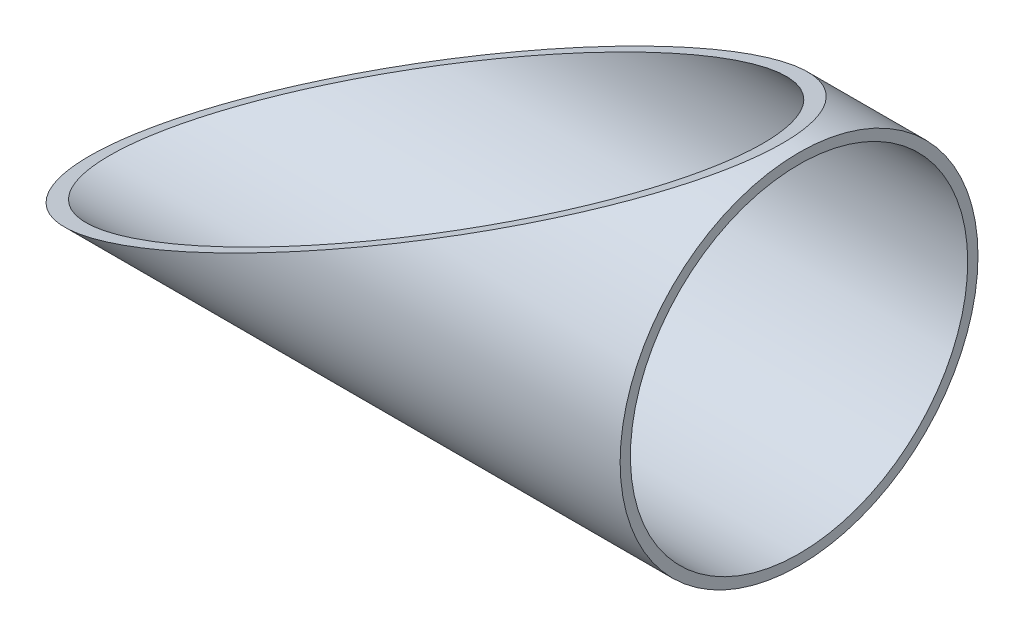
ISO-10303-21;
HEADER;
FILE_DESCRIPTION(('STEP AP214'),'2;1');
FILE_NAME('part.step','',(''),(''),'','','');
FILE_SCHEMA(('AUTOMOTIVE_DESIGN { 1 0 10303 214 1 1 1 1 }'));
ENDSEC;
DATA;
#1=APPLICATION_CONTEXT('core data for automotive mechanical design processes');
#2=APPLICATION_PROTOCOL_DEFINITION('international standard','automotive_design',2000,#1);
#3=PRODUCT_CONTEXT('',#1,'mechanical');
#4=PRODUCT('Part','Part','',(#3));
#5=PRODUCT_RELATED_PRODUCT_CATEGORY('part','',(#4));
#6=PRODUCT_DEFINITION_FORMATION('','',#4);
#7=PRODUCT_DEFINITION_CONTEXT('part definition',#1,'design');
#8=PRODUCT_DEFINITION('design','',#6,#7);
#9=PRODUCT_DEFINITION_SHAPE('','',#8);
#10=(LENGTH_UNIT() NAMED_UNIT(*) SI_UNIT(.MILLI.,.METRE.));
#11=(NAMED_UNIT(*) PLANE_ANGLE_UNIT() SI_UNIT($,.RADIAN.));
#12=(NAMED_UNIT(*) SI_UNIT($,.STERADIAN.) SOLID_ANGLE_UNIT());
#13=UNCERTAINTY_MEASURE_WITH_UNIT(LENGTH_MEASURE(1.E-05),#10,'distance_accuracy_value','');
#14=(GEOMETRIC_REPRESENTATION_CONTEXT(3) GLOBAL_UNCERTAINTY_ASSIGNED_CONTEXT((#13)) GLOBAL_UNIT_ASSIGNED_CONTEXT((#10,
#11,#12)) REPRESENTATION_CONTEXT('',''));
#15=CARTESIAN_POINT('',(0.,0.,0.));
#16=DIRECTION('',(0.,0.,1.));
#17=DIRECTION('',(1.,0.,0.));
#18=AXIS2_PLACEMENT_3D('',#15,#16,#17);
#19=CARTESIAN_POINT('',(1.37592875931075,-2.66586197116458,0.));
#20=DIRECTION('',(-0.458642919770252,0.888620657054864,0.));
#21=DIRECTION('',(-0.888620657054864,-0.458642919770252,0.));
#22=AXIS2_PLACEMENT_3D('',#19,#20,#21);
#23=PLANE('',#22);
#24=CARTESIAN_POINT('',(43.3535363284421,19.,85.));
#25=DIRECTION('',(0.458642919770252,-0.888620657054864,0.));
#26=DIRECTION('',(-0.888620657054864,-0.458642919770252,0.));
#27=AXIS2_PLACEMENT_3D('',#24,#25,#26);
#28=ELLIPSE('',#27,18.9690053524822,8.7);
#29=CARTESIAN_POINT('',(26.4972863284421,10.3,85.));
#30=VERTEX_POINT('',#29);
#31=EDGE_CURVE('E38',#30,#30,#28,.F.);
#32=ORIENTED_EDGE('',*,*,#31,.T.);
#33=EDGE_LOOP('',(#32));
#34=FACE_BOUND('',#33,.T.);
#35=CARTESIAN_POINT('',(43.3535363284421,19.,85.));
#36=DIRECTION('',(-0.458642919770252,0.888620657054864,0.));
#37=DIRECTION('',(-0.888620657054864,-0.458642919770252,0.));
#38=AXIS2_PLACEMENT_3D('',#35,#36,#37);
#39=ELLIPSE('',#38,17.8788326310752,8.2);
#40=CARTESIAN_POINT('',(27.4660363284421,10.8,85.));
#41=VERTEX_POINT('',#40);
#42=EDGE_CURVE('E47',#41,#41,#39,.T.);
#43=ORIENTED_EDGE('',*,*,#42,.F.);
#44=EDGE_LOOP('',(#43));
#45=FACE_BOUND('',#44,.T.);
#46=ADVANCED_FACE('F35',(#34,#45),#23,.T.);
#47=CARTESIAN_POINT('',(61.,19.,85.));
#48=DIRECTION('',(1.,0.,0.));
#49=DIRECTION('',(0.,0.,-1.));
#50=AXIS2_PLACEMENT_3D('',#47,#48,#49);
#51=PLANE('',#50);
#52=CARTESIAN_POINT('',(61.,19.,85.));
#53=DIRECTION('',(1.,0.,0.));
#54=DIRECTION('',(0.,0.,-1.));
#55=AXIS2_PLACEMENT_3D('',#52,#53,#54);
#56=CIRCLE('',#55,8.7);
#57=CARTESIAN_POINT('',(61.,19.,76.3));
#58=VERTEX_POINT('',#57);
#59=EDGE_CURVE('E10',#58,#58,#56,.T.);
#60=ORIENTED_EDGE('',*,*,#59,.T.);
#61=EDGE_LOOP('',(#60));
#62=FACE_BOUND('',#61,.T.);
#63=CARTESIAN_POINT('',(61.,19.,85.));
#64=DIRECTION('',(1.,0.,0.));
#65=DIRECTION('',(0.,0.,-1.));
#66=AXIS2_PLACEMENT_3D('',#63,#64,#65);
#67=CIRCLE('',#66,8.2);
#68=CARTESIAN_POINT('',(61.,19.,76.8));
#69=VERTEX_POINT('',#68);
#70=EDGE_CURVE('E42',#69,#69,#67,.T.);
#71=ORIENTED_EDGE('',*,*,#70,.F.);
#72=EDGE_LOOP('',(#71));
#73=FACE_BOUND('',#72,.T.);
#74=ADVANCED_FACE('F65',(#62,#73),#51,.T.);
#75=CARTESIAN_POINT('',(61.,19.,85.));
#76=DIRECTION('',(-1.,0.,0.));
#77=DIRECTION('',(0.,0.,1.));
#78=AXIS2_PLACEMENT_3D('',#75,#76,#77);
#79=CYLINDRICAL_SURFACE('',#78,8.2);
#80=ORIENTED_EDGE('',*,*,#70,.T.);
#81=EDGE_LOOP('',(#80));
#82=FACE_BOUND('',#81,.T.);
#83=ORIENTED_EDGE('',*,*,#42,.T.);
#84=EDGE_LOOP('',(#83));
#85=FACE_BOUND('',#84,.T.);
#86=ADVANCED_FACE('F60',(#82,#85),#79,.F.);
#87=CARTESIAN_POINT('',(61.,19.,85.));
#88=DIRECTION('',(-1.,0.,0.));
#89=DIRECTION('',(0.,0.,1.));
#90=AXIS2_PLACEMENT_3D('',#87,#88,#89);
#91=CYLINDRICAL_SURFACE('',#90,8.7);
#92=ORIENTED_EDGE('',*,*,#31,.F.);
#93=EDGE_LOOP('',(#92));
#94=FACE_BOUND('',#93,.T.);
#95=ORIENTED_EDGE('',*,*,#59,.F.);
#96=EDGE_LOOP('',(#95));
#97=FACE_BOUND('',#96,.T.);
#98=ADVANCED_FACE('F57',(#94,#97),#91,.T.);
#99=CLOSED_SHELL('',(#46,#74,#86,#98));
#100=MANIFOLD_SOLID_BREP('B2',#99);
#101=ADVANCED_BREP_SHAPE_REPRESENTATION('',(#18,#100),#14);
#102=SHAPE_DEFINITION_REPRESENTATION(#9,#101);
ENDSEC;
END-ISO-10303-21;
